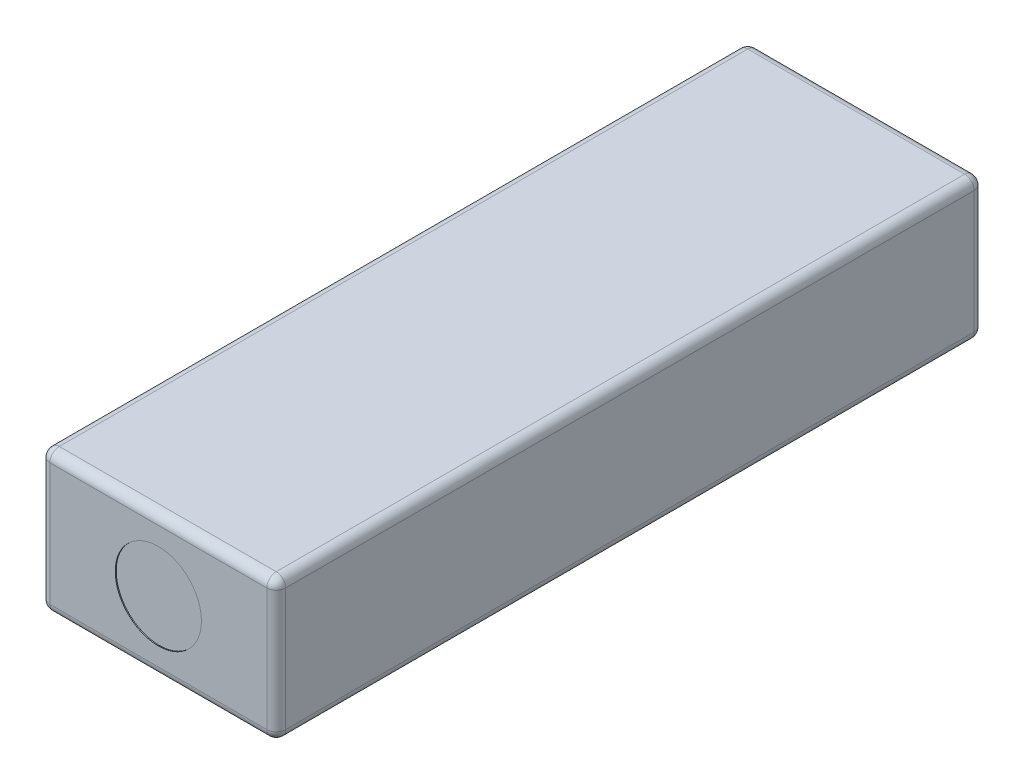
ISO-10303-21;
HEADER;
FILE_DESCRIPTION(('STEP AP214'),'2;1');
FILE_NAME('part.step','',(''),(''),'','','');
FILE_SCHEMA(('AUTOMOTIVE_DESIGN { 1 0 10303 214 1 1 1 1 }'));
ENDSEC;
DATA;
#1=APPLICATION_CONTEXT('core data for automotive mechanical design processes');
#2=APPLICATION_PROTOCOL_DEFINITION('international standard','automotive_design',2000,#1);
#3=PRODUCT_CONTEXT('',#1,'mechanical');
#4=PRODUCT('Part','Part','',(#3));
#5=PRODUCT_RELATED_PRODUCT_CATEGORY('part','',(#4));
#6=PRODUCT_DEFINITION_FORMATION('','',#4);
#7=PRODUCT_DEFINITION_CONTEXT('part definition',#1,'design');
#8=PRODUCT_DEFINITION('design','',#6,#7);
#9=PRODUCT_DEFINITION_SHAPE('','',#8);
#10=(LENGTH_UNIT() NAMED_UNIT(*) SI_UNIT(.MILLI.,.METRE.));
#11=(NAMED_UNIT(*) PLANE_ANGLE_UNIT() SI_UNIT($,.RADIAN.));
#12=(NAMED_UNIT(*) SI_UNIT($,.STERADIAN.) SOLID_ANGLE_UNIT());
#13=UNCERTAINTY_MEASURE_WITH_UNIT(LENGTH_MEASURE(1.E-05),#10,'distance_accuracy_value','');
#14=(GEOMETRIC_REPRESENTATION_CONTEXT(3) GLOBAL_UNCERTAINTY_ASSIGNED_CONTEXT((#13)) GLOBAL_UNIT_ASSIGNED_CONTEXT((#10,
#11,#12)) REPRESENTATION_CONTEXT('',''));
#15=CARTESIAN_POINT('',(0.,0.,0.));
#16=DIRECTION('',(0.,0.,1.));
#17=DIRECTION('',(1.,0.,0.));
#18=AXIS2_PLACEMENT_3D('',#15,#16,#17);
#19=CARTESIAN_POINT('',(25.,30.,-75.));
#20=DIRECTION('',(-1.,0.,0.));
#21=DIRECTION('',(0.,0.,1.));
#22=AXIS2_PLACEMENT_3D('',#19,#20,#21);
#23=PLANE('',#22);
#24=DIRECTION('',(0.,-1.,0.));
#25=VECTOR('',#24,1.);
#26=CARTESIAN_POINT('',(25.,30.,73.));
#27=LINE('',#26,#25);
#28=CARTESIAN_POINT('',(25.,28.,73.));
#29=VERTEX_POINT('',#28);
#30=CARTESIAN_POINT('',(25.,2.,73.));
#31=VERTEX_POINT('',#30);
#32=EDGE_CURVE('E141',#29,#31,#27,.T.);
#33=ORIENTED_EDGE('',*,*,#32,.T.);
#34=DIRECTION('',(0.,0.,-1.));
#35=VECTOR('',#34,1.);
#36=CARTESIAN_POINT('',(25.,2.,-75.));
#37=LINE('',#36,#35);
#38=CARTESIAN_POINT('',(25.,2.,-73.));
#39=VERTEX_POINT('',#38);
#40=EDGE_CURVE('E136',#31,#39,#37,.T.);
#41=ORIENTED_EDGE('',*,*,#40,.T.);
#42=DIRECTION('',(0.,-1.,0.));
#43=VECTOR('',#42,1.);
#44=CARTESIAN_POINT('',(25.,30.,-73.));
#45=LINE('',#44,#43);
#46=CARTESIAN_POINT('',(25.,28.,-73.));
#47=VERTEX_POINT('',#46);
#48=EDGE_CURVE('E131',#39,#47,#45,.F.);
#49=ORIENTED_EDGE('',*,*,#48,.T.);
#50=DIRECTION('',(0.,0.,-1.));
#51=VECTOR('',#50,1.);
#52=CARTESIAN_POINT('',(25.,28.,75.));
#53=LINE('',#52,#51);
#54=EDGE_CURVE('E133',#47,#29,#53,.F.);
#55=ORIENTED_EDGE('',*,*,#54,.T.);
#56=EDGE_LOOP('',(#33,#41,#49,#55));
#57=FACE_BOUND('',#56,.T.);
#58=ADVANCED_FACE('F42',(#57),#23,.F.);
#59=CARTESIAN_POINT('',(-25.,30.,-75.));
#60=DIRECTION('',(0.,0.,1.));
#61=DIRECTION('',(1.,0.,0.));
#62=AXIS2_PLACEMENT_3D('',#59,#60,#61);
#63=PLANE('',#62);
#64=DIRECTION('',(-1.,0.,0.));
#65=VECTOR('',#64,1.);
#66=CARTESIAN_POINT('',(25.,28.,-75.));
#67=LINE('',#66,#65);
#68=CARTESIAN_POINT('',(-23.,28.,-75.));
#69=VERTEX_POINT('',#68);
#70=CARTESIAN_POINT('',(23.,28.,-75.));
#71=VERTEX_POINT('',#70);
#72=EDGE_CURVE('E266',#69,#71,#67,.F.);
#73=ORIENTED_EDGE('',*,*,#72,.T.);
#74=DIRECTION('',(0.,-1.,0.));
#75=VECTOR('',#74,1.);
#76=CARTESIAN_POINT('',(23.,30.,-75.));
#77=LINE('',#76,#75);
#78=CARTESIAN_POINT('',(23.,2.,-75.));
#79=VERTEX_POINT('',#78);
#80=EDGE_CURVE('E165',#71,#79,#77,.T.);
#81=ORIENTED_EDGE('',*,*,#80,.T.);
#82=DIRECTION('',(-1.,0.,0.));
#83=VECTOR('',#82,1.);
#84=CARTESIAN_POINT('',(-25.,2.,-75.));
#85=LINE('',#84,#83);
#86=CARTESIAN_POINT('',(-23.,2.,-75.));
#87=VERTEX_POINT('',#86);
#88=EDGE_CURVE('E269',#79,#87,#85,.T.);
#89=ORIENTED_EDGE('',*,*,#88,.T.);
#90=DIRECTION('',(0.,-1.,0.));
#91=VECTOR('',#90,1.);
#92=CARTESIAN_POINT('',(-23.,30.,-75.));
#93=LINE('',#92,#91);
#94=EDGE_CURVE('E263',#87,#69,#93,.F.);
#95=ORIENTED_EDGE('',*,*,#94,.T.);
#96=EDGE_LOOP('',(#73,#81,#89,#95));
#97=FACE_BOUND('',#96,.T.);
#98=ADVANCED_FACE('F341',(#97),#63,.F.);
#99=CARTESIAN_POINT('',(-25.,30.,-75.));
#100=DIRECTION('',(1.,0.,0.));
#101=DIRECTION('',(0.,0.,-1.));
#102=AXIS2_PLACEMENT_3D('',#99,#100,#101);
#103=PLANE('',#102);
#104=DIRECTION('',(0.,0.,1.));
#105=VECTOR('',#104,1.);
#106=CARTESIAN_POINT('',(-25.,28.,-75.));
#107=LINE('',#106,#105);
#108=CARTESIAN_POINT('',(-25.,28.,73.));
#109=VERTEX_POINT('',#108);
#110=CARTESIAN_POINT('',(-25.,28.,-73.));
#111=VERTEX_POINT('',#110);
#112=EDGE_CURVE('E52',#109,#111,#107,.F.);
#113=ORIENTED_EDGE('',*,*,#112,.T.);
#114=DIRECTION('',(0.,-1.,0.));
#115=VECTOR('',#114,1.);
#116=CARTESIAN_POINT('',(-25.,30.,-73.));
#117=LINE('',#116,#115);
#118=CARTESIAN_POINT('',(-25.,2.,-73.));
#119=VERTEX_POINT('',#118);
#120=EDGE_CURVE('E11',#111,#119,#117,.T.);
#121=ORIENTED_EDGE('',*,*,#120,.T.);
#122=DIRECTION('',(0.,0.,1.));
#123=VECTOR('',#122,1.);
#124=CARTESIAN_POINT('',(-25.,2.,-75.));
#125=LINE('',#124,#123);
#126=CARTESIAN_POINT('',(-25.,2.,73.));
#127=VERTEX_POINT('',#126);
#128=EDGE_CURVE('E287',#119,#127,#125,.T.);
#129=ORIENTED_EDGE('',*,*,#128,.T.);
#130=DIRECTION('',(0.,-1.,0.));
#131=VECTOR('',#130,1.);
#132=CARTESIAN_POINT('',(-25.,30.,73.));
#133=LINE('',#132,#131);
#134=EDGE_CURVE('E63',#127,#109,#133,.F.);
#135=ORIENTED_EDGE('',*,*,#134,.T.);
#136=EDGE_LOOP('',(#113,#121,#129,#135));
#137=FACE_BOUND('',#136,.T.);
#138=ADVANCED_FACE('F354',(#137),#103,.F.);
#139=CARTESIAN_POINT('',(-25.,30.,75.));
#140=DIRECTION('',(0.,0.,-1.));
#141=DIRECTION('',(-1.,0.,0.));
#142=AXIS2_PLACEMENT_3D('',#139,#140,#141);
#143=PLANE('',#142);
#144=CARTESIAN_POINT('',(0.,15.,75.));
#145=DIRECTION('',(0.,0.,1.));
#146=DIRECTION('',(1.,0.,0.));
#147=AXIS2_PLACEMENT_3D('',#144,#145,#146);
#148=CIRCLE('',#147,9.14009032187981);
#149=CARTESIAN_POINT('',(9.14009032187981,15.,75.));
#150=VERTEX_POINT('',#149);
#151=EDGE_CURVE('E659',#150,#150,#148,.T.);
#152=ORIENTED_EDGE('',*,*,#151,.F.);
#153=EDGE_LOOP('',(#152));
#154=FACE_BOUND('',#153,.T.);
#155=DIRECTION('',(1.,0.,0.));
#156=VECTOR('',#155,1.);
#157=CARTESIAN_POINT('',(-25.,2.,75.));
#158=LINE('',#157,#156);
#159=CARTESIAN_POINT('',(-23.,2.,75.));
#160=VERTEX_POINT('',#159);
#161=CARTESIAN_POINT('',(23.,2.,75.));
#162=VERTEX_POINT('',#161);
#163=EDGE_CURVE('E250',#160,#162,#158,.T.);
#164=ORIENTED_EDGE('',*,*,#163,.T.);
#165=DIRECTION('',(0.,-1.,0.));
#166=VECTOR('',#165,1.);
#167=CARTESIAN_POINT('',(23.,30.,75.));
#168=LINE('',#167,#166);
#169=CARTESIAN_POINT('',(23.,28.,75.));
#170=VERTEX_POINT('',#169);
#171=EDGE_CURVE('E259',#162,#170,#168,.F.);
#172=ORIENTED_EDGE('',*,*,#171,.T.);
#173=DIRECTION('',(1.,0.,0.));
#174=VECTOR('',#173,1.);
#175=CARTESIAN_POINT('',(-25.,28.,75.));
#176=LINE('',#175,#174);
#177=CARTESIAN_POINT('',(-23.,28.,75.));
#178=VERTEX_POINT('',#177);
#179=EDGE_CURVE('E245',#170,#178,#176,.F.);
#180=ORIENTED_EDGE('',*,*,#179,.T.);
#181=DIRECTION('',(0.,-1.,0.));
#182=VECTOR('',#181,1.);
#183=CARTESIAN_POINT('',(-23.,30.,75.));
#184=LINE('',#183,#182);
#185=EDGE_CURVE('E241',#178,#160,#184,.T.);
#186=ORIENTED_EDGE('',*,*,#185,.T.);
#187=EDGE_LOOP('',(#164,#172,#180,#186));
#188=FACE_BOUND('',#187,.T.);
#189=ADVANCED_FACE('F362',(#154,#188),#143,.F.);
#190=CARTESIAN_POINT('',(0.,30.,0.));
#191=DIRECTION('',(0.,1.,0.));
#192=DIRECTION('',(0.,0.,1.));
#193=AXIS2_PLACEMENT_3D('',#190,#191,#192);
#194=PLANE('',#193);
#195=DIRECTION('',(1.,0.,0.));
#196=VECTOR('',#195,1.);
#197=CARTESIAN_POINT('',(25.,30.,73.));
#198=LINE('',#197,#196);
#199=CARTESIAN_POINT('',(-23.,30.,73.));
#200=VERTEX_POINT('',#199);
#201=CARTESIAN_POINT('',(23.,30.,73.));
#202=VERTEX_POINT('',#201);
#203=EDGE_CURVE('E280',#200,#202,#198,.T.);
#204=ORIENTED_EDGE('',*,*,#203,.T.);
#205=DIRECTION('',(0.,0.,-1.));
#206=VECTOR('',#205,1.);
#207=CARTESIAN_POINT('',(23.,30.,-75.));
#208=LINE('',#207,#206);
#209=CARTESIAN_POINT('',(23.,30.,-73.));
#210=VERTEX_POINT('',#209);
#211=EDGE_CURVE('E284',#202,#210,#208,.T.);
#212=ORIENTED_EDGE('',*,*,#211,.T.);
#213=DIRECTION('',(-1.,0.,0.));
#214=VECTOR('',#213,1.);
#215=CARTESIAN_POINT('',(-25.,30.,-73.));
#216=LINE('',#215,#214);
#217=CARTESIAN_POINT('',(-23.,30.,-73.));
#218=VERTEX_POINT('',#217);
#219=EDGE_CURVE('E277',#210,#218,#216,.T.);
#220=ORIENTED_EDGE('',*,*,#219,.T.);
#221=DIRECTION('',(0.,0.,1.));
#222=VECTOR('',#221,1.);
#223=CARTESIAN_POINT('',(-23.,30.,75.));
#224=LINE('',#223,#222);
#225=EDGE_CURVE('E274',#218,#200,#224,.T.);
#226=ORIENTED_EDGE('',*,*,#225,.T.);
#227=EDGE_LOOP('',(#204,#212,#220,#226));
#228=FACE_BOUND('',#227,.T.);
#229=ADVANCED_FACE('F347',(#228),#194,.T.);
#230=CARTESIAN_POINT('',(0.,0.,0.));
#231=DIRECTION('',(0.,1.,0.));
#232=DIRECTION('',(0.,0.,1.));
#233=AXIS2_PLACEMENT_3D('',#230,#231,#232);
#234=PLANE('',#233);
#235=DIRECTION('',(-1.,0.,0.));
#236=VECTOR('',#235,1.);
#237=CARTESIAN_POINT('',(0.,0.,-73.));
#238=LINE('',#237,#236);
#239=CARTESIAN_POINT('',(-23.,0.,-73.));
#240=VERTEX_POINT('',#239);
#241=CARTESIAN_POINT('',(23.,0.,-73.));
#242=VERTEX_POINT('',#241);
#243=EDGE_CURVE('E325',#240,#242,#238,.F.);
#244=ORIENTED_EDGE('',*,*,#243,.T.);
#245=DIRECTION('',(0.,0.,-1.));
#246=VECTOR('',#245,1.);
#247=CARTESIAN_POINT('',(23.,0.,0.));
#248=LINE('',#247,#246);
#249=CARTESIAN_POINT('',(23.,0.,73.));
#250=VERTEX_POINT('',#249);
#251=EDGE_CURVE('E246',#242,#250,#248,.F.);
#252=ORIENTED_EDGE('',*,*,#251,.T.);
#253=DIRECTION('',(1.,0.,0.));
#254=VECTOR('',#253,1.);
#255=CARTESIAN_POINT('',(0.,0.,73.));
#256=LINE('',#255,#254);
#257=CARTESIAN_POINT('',(-23.,0.,73.));
#258=VERTEX_POINT('',#257);
#259=EDGE_CURVE('E253',#250,#258,#256,.F.);
#260=ORIENTED_EDGE('',*,*,#259,.T.);
#261=DIRECTION('',(0.,0.,1.));
#262=VECTOR('',#261,1.);
#263=CARTESIAN_POINT('',(-23.,0.,0.));
#264=LINE('',#263,#262);
#265=EDGE_CURVE('E358',#258,#240,#264,.F.);
#266=ORIENTED_EDGE('',*,*,#265,.T.);
#267=EDGE_LOOP('',(#244,#252,#260,#266));
#268=FACE_BOUND('',#267,.T.);
#269=ADVANCED_FACE('F327',(#268),#234,.F.);
#270=CARTESIAN_POINT('',(-23.,28.,0.));
#271=DIRECTION('',(0.,0.,-1.));
#272=DIRECTION('',(-1.,0.,0.));
#273=AXIS2_PLACEMENT_3D('',#270,#271,#272);
#274=CYLINDRICAL_SURFACE('',#273,2.);
#275=CARTESIAN_POINT('',(-23.,28.,73.));
#276=DIRECTION('',(0.,0.,1.));
#277=DIRECTION('',(1.,0.,0.));
#278=AXIS2_PLACEMENT_3D('',#275,#276,#277);
#279=CIRCLE('',#278,2.);
#280=EDGE_CURVE('E46',#200,#109,#279,.T.);
#281=ORIENTED_EDGE('',*,*,#280,.F.);
#282=ORIENTED_EDGE('',*,*,#225,.F.);
#283=CARTESIAN_POINT('',(-23.,28.,-73.));
#284=DIRECTION('',(0.,0.,-1.));
#285=DIRECTION('',(-1.,0.,0.));
#286=AXIS2_PLACEMENT_3D('',#283,#284,#285);
#287=CIRCLE('',#286,2.);
#288=EDGE_CURVE('E220',#111,#218,#287,.T.);
#289=ORIENTED_EDGE('',*,*,#288,.F.);
#290=ORIENTED_EDGE('',*,*,#112,.F.);
#291=EDGE_LOOP('',(#281,#282,#289,#290));
#292=FACE_BOUND('',#291,.T.);
#293=ADVANCED_FACE('F44',(#292),#274,.T.);
#294=CARTESIAN_POINT('',(-23.,28.,73.));
#295=DIRECTION('',(-1.,0.,0.));
#296=DIRECTION('',(0.,0.,1.));
#297=AXIS2_PLACEMENT_3D('',#294,#295,#296);
#298=SPHERICAL_SURFACE('',#297,2.);
#299=CARTESIAN_POINT('',(-23.,28.,73.));
#300=DIRECTION('',(-1.,0.,0.));
#301=DIRECTION('',(0.,0.,1.));
#302=AXIS2_PLACEMENT_3D('',#299,#300,#301);
#303=CIRCLE('',#302,2.);
#304=EDGE_CURVE('E213',#200,#178,#303,.F.);
#305=ORIENTED_EDGE('',*,*,#304,.F.);
#306=ORIENTED_EDGE('',*,*,#280,.T.);
#307=CARTESIAN_POINT('',(-23.,28.,73.));
#308=DIRECTION('',(0.,1.,0.));
#309=DIRECTION('',(0.,0.,1.));
#310=AXIS2_PLACEMENT_3D('',#307,#308,#309);
#311=CIRCLE('',#310,2.);
#312=EDGE_CURVE('E217',#178,#109,#311,.F.);
#313=ORIENTED_EDGE('',*,*,#312,.F.);
#314=EDGE_LOOP('',(#305,#306,#313));
#315=FACE_BOUND('',#314,.T.);
#316=ADVANCED_FACE('F232',(#315),#298,.T.);
#317=CARTESIAN_POINT('',(-23.,28.,-73.));
#318=DIRECTION('',(0.,1.,0.));
#319=DIRECTION('',(0.,0.,1.));
#320=AXIS2_PLACEMENT_3D('',#317,#318,#319);
#321=SPHERICAL_SURFACE('',#320,2.);
#322=CARTESIAN_POINT('',(-23.,28.,-73.));
#323=DIRECTION('',(0.,1.,0.));
#324=DIRECTION('',(0.,0.,1.));
#325=AXIS2_PLACEMENT_3D('',#322,#323,#324);
#326=CIRCLE('',#325,2.);
#327=EDGE_CURVE('E205',#111,#69,#326,.F.);
#328=ORIENTED_EDGE('',*,*,#327,.F.);
#329=ORIENTED_EDGE('',*,*,#288,.T.);
#330=CARTESIAN_POINT('',(-23.,28.,-73.));
#331=DIRECTION('',(-1.,0.,0.));
#332=DIRECTION('',(0.,0.,1.));
#333=AXIS2_PLACEMENT_3D('',#330,#331,#332);
#334=CIRCLE('',#333,2.);
#335=EDGE_CURVE('E209',#69,#218,#334,.F.);
#336=ORIENTED_EDGE('',*,*,#335,.F.);
#337=EDGE_LOOP('',(#328,#329,#336));
#338=FACE_BOUND('',#337,.T.);
#339=ADVANCED_FACE('F349',(#338),#321,.T.);
#340=CARTESIAN_POINT('',(-23.,30.,73.));
#341=DIRECTION('',(0.,-1.,0.));
#342=DIRECTION('',(0.,0.,-1.));
#343=AXIS2_PLACEMENT_3D('',#340,#341,#342);
#344=CYLINDRICAL_SURFACE('',#343,2.);
#345=ORIENTED_EDGE('',*,*,#312,.T.);
#346=ORIENTED_EDGE('',*,*,#134,.F.);
#347=CARTESIAN_POINT('',(-23.,2.,73.));
#348=DIRECTION('',(0.,-1.,0.));
#349=DIRECTION('',(0.,0.,-1.));
#350=AXIS2_PLACEMENT_3D('',#347,#348,#349);
#351=CIRCLE('',#350,2.);
#352=EDGE_CURVE('E197',#160,#127,#351,.T.);
#353=ORIENTED_EDGE('',*,*,#352,.F.);
#354=ORIENTED_EDGE('',*,*,#185,.F.);
#355=EDGE_LOOP('',(#345,#346,#353,#354));
#356=FACE_BOUND('',#355,.T.);
#357=ADVANCED_FACE('F238',(#356),#344,.T.);
#358=CARTESIAN_POINT('',(0.,28.,73.));
#359=DIRECTION('',(-1.,0.,0.));
#360=DIRECTION('',(0.,0.,1.));
#361=AXIS2_PLACEMENT_3D('',#358,#359,#360);
#362=CYLINDRICAL_SURFACE('',#361,2.);
#363=ORIENTED_EDGE('',*,*,#304,.T.);
#364=ORIENTED_EDGE('',*,*,#179,.F.);
#365=CARTESIAN_POINT('',(23.,28.,73.));
#366=DIRECTION('',(1.,0.,0.));
#367=DIRECTION('',(0.,0.,-1.));
#368=AXIS2_PLACEMENT_3D('',#365,#366,#367);
#369=CIRCLE('',#368,2.);
#370=EDGE_CURVE('E193',#202,#170,#369,.T.);
#371=ORIENTED_EDGE('',*,*,#370,.F.);
#372=ORIENTED_EDGE('',*,*,#203,.F.);
#373=EDGE_LOOP('',(#363,#364,#371,#372));
#374=FACE_BOUND('',#373,.T.);
#375=ADVANCED_FACE('F371',(#374),#362,.T.);
#376=CARTESIAN_POINT('',(23.,28.,0.));
#377=DIRECTION('',(0.,0.,1.));
#378=DIRECTION('',(1.,0.,0.));
#379=AXIS2_PLACEMENT_3D('',#376,#377,#378);
#380=CYLINDRICAL_SURFACE('',#379,2.);
#381=CARTESIAN_POINT('',(23.,28.,-73.));
#382=DIRECTION('',(0.,0.,-1.));
#383=DIRECTION('',(-1.,0.,0.));
#384=AXIS2_PLACEMENT_3D('',#381,#382,#383);
#385=CIRCLE('',#384,2.);
#386=EDGE_CURVE('E148',#210,#47,#385,.T.);
#387=ORIENTED_EDGE('',*,*,#386,.F.);
#388=ORIENTED_EDGE('',*,*,#211,.F.);
#389=CARTESIAN_POINT('',(23.,28.,73.));
#390=DIRECTION('',(0.,0.,1.));
#391=DIRECTION('',(1.,0.,0.));
#392=AXIS2_PLACEMENT_3D('',#389,#390,#391);
#393=CIRCLE('',#392,2.);
#394=EDGE_CURVE('E150',#29,#202,#393,.T.);
#395=ORIENTED_EDGE('',*,*,#394,.F.);
#396=ORIENTED_EDGE('',*,*,#54,.F.);
#397=EDGE_LOOP('',(#387,#388,#395,#396));
#398=FACE_BOUND('',#397,.T.);
#399=ADVANCED_FACE('F146',(#398),#380,.T.);
#400=CARTESIAN_POINT('',(0.,28.,-73.));
#401=DIRECTION('',(1.,0.,0.));
#402=DIRECTION('',(0.,0.,-1.));
#403=AXIS2_PLACEMENT_3D('',#400,#401,#402);
#404=CYLINDRICAL_SURFACE('',#403,2.);
#405=ORIENTED_EDGE('',*,*,#335,.T.);
#406=ORIENTED_EDGE('',*,*,#219,.F.);
#407=CARTESIAN_POINT('',(23.,28.,-73.));
#408=DIRECTION('',(1.,0.,0.));
#409=DIRECTION('',(0.,0.,-1.));
#410=AXIS2_PLACEMENT_3D('',#407,#408,#409);
#411=CIRCLE('',#410,2.);
#412=EDGE_CURVE('E160',#71,#210,#411,.T.);
#413=ORIENTED_EDGE('',*,*,#412,.F.);
#414=ORIENTED_EDGE('',*,*,#72,.F.);
#415=EDGE_LOOP('',(#405,#406,#413,#414));
#416=FACE_BOUND('',#415,.T.);
#417=ADVANCED_FACE('F345',(#416),#404,.T.);
#418=CARTESIAN_POINT('',(-23.,30.,-73.));
#419=DIRECTION('',(0.,-1.,0.));
#420=DIRECTION('',(0.,0.,-1.));
#421=AXIS2_PLACEMENT_3D('',#418,#419,#420);
#422=CYLINDRICAL_SURFACE('',#421,2.);
#423=ORIENTED_EDGE('',*,*,#327,.T.);
#424=ORIENTED_EDGE('',*,*,#94,.F.);
#425=CARTESIAN_POINT('',(-23.,2.,-73.));
#426=DIRECTION('',(0.,-1.,0.));
#427=DIRECTION('',(0.,0.,-1.));
#428=AXIS2_PLACEMENT_3D('',#425,#426,#427);
#429=CIRCLE('',#428,2.);
#430=EDGE_CURVE('E185',#119,#87,#429,.T.);
#431=ORIENTED_EDGE('',*,*,#430,.F.);
#432=ORIENTED_EDGE('',*,*,#120,.F.);
#433=EDGE_LOOP('',(#423,#424,#431,#432));
#434=FACE_BOUND('',#433,.T.);
#435=ADVANCED_FACE('F352',(#434),#422,.T.);
#436=CARTESIAN_POINT('',(-23.,2.,-75.));
#437=DIRECTION('',(0.,0.,1.));
#438=DIRECTION('',(1.,0.,0.));
#439=AXIS2_PLACEMENT_3D('',#436,#437,#438);
#440=CYLINDRICAL_SURFACE('',#439,2.);
#441=CARTESIAN_POINT('',(-23.,2.,73.));
#442=DIRECTION('',(0.,0.,1.));
#443=DIRECTION('',(1.,0.,0.));
#444=AXIS2_PLACEMENT_3D('',#441,#442,#443);
#445=CIRCLE('',#444,2.);
#446=EDGE_CURVE('E201',#127,#258,#445,.T.);
#447=ORIENTED_EDGE('',*,*,#446,.F.);
#448=ORIENTED_EDGE('',*,*,#128,.F.);
#449=CARTESIAN_POINT('',(-23.,2.,-73.));
#450=DIRECTION('',(0.,0.,-1.));
#451=DIRECTION('',(-1.,0.,0.));
#452=AXIS2_PLACEMENT_3D('',#449,#450,#451);
#453=CIRCLE('',#452,2.);
#454=EDGE_CURVE('E182',#240,#119,#453,.T.);
#455=ORIENTED_EDGE('',*,*,#454,.F.);
#456=ORIENTED_EDGE('',*,*,#265,.F.);
#457=EDGE_LOOP('',(#447,#448,#455,#456));
#458=FACE_BOUND('',#457,.T.);
#459=ADVANCED_FACE('F357',(#458),#440,.T.);
#460=CARTESIAN_POINT('',(-23.,2.,73.));
#461=DIRECTION('',(-1.,0.,0.));
#462=DIRECTION('',(0.,-1.,0.));
#463=AXIS2_PLACEMENT_3D('',#460,#461,#462);
#464=SPHERICAL_SURFACE('',#463,2.);
#465=ORIENTED_EDGE('',*,*,#352,.T.);
#466=ORIENTED_EDGE('',*,*,#446,.T.);
#467=CARTESIAN_POINT('',(-23.,2.,73.));
#468=DIRECTION('',(-1.,0.,0.));
#469=DIRECTION('',(0.,0.,1.));
#470=AXIS2_PLACEMENT_3D('',#467,#468,#469);
#471=CIRCLE('',#470,2.);
#472=EDGE_CURVE('E172',#160,#258,#471,.F.);
#473=ORIENTED_EDGE('',*,*,#472,.F.);
#474=EDGE_LOOP('',(#465,#466,#473));
#475=FACE_BOUND('',#474,.T.);
#476=ADVANCED_FACE('F360',(#475),#464,.T.);
#477=CARTESIAN_POINT('',(23.,28.,73.));
#478=DIRECTION('',(0.,1.,0.));
#479=DIRECTION('',(0.,0.,1.));
#480=AXIS2_PLACEMENT_3D('',#477,#478,#479);
#481=SPHERICAL_SURFACE('',#480,2.);
#482=ORIENTED_EDGE('',*,*,#394,.T.);
#483=ORIENTED_EDGE('',*,*,#370,.T.);
#484=CARTESIAN_POINT('',(23.,28.,73.));
#485=DIRECTION('',(0.,1.,0.));
#486=DIRECTION('',(0.,0.,1.));
#487=AXIS2_PLACEMENT_3D('',#484,#485,#486);
#488=CIRCLE('',#487,2.);
#489=EDGE_CURVE('E167',#29,#170,#488,.F.);
#490=ORIENTED_EDGE('',*,*,#489,.F.);
#491=EDGE_LOOP('',(#482,#483,#490));
#492=FACE_BOUND('',#491,.T.);
#493=ADVANCED_FACE('F369',(#492),#481,.T.);
#494=CARTESIAN_POINT('',(23.,28.,-73.));
#495=DIRECTION('',(0.,1.,0.));
#496=DIRECTION('',(0.,0.,1.));
#497=AXIS2_PLACEMENT_3D('',#494,#495,#496);
#498=SPHERICAL_SURFACE('',#497,2.);
#499=ORIENTED_EDGE('',*,*,#412,.T.);
#500=ORIENTED_EDGE('',*,*,#386,.T.);
#501=CARTESIAN_POINT('',(23.,28.,-73.));
#502=DIRECTION('',(0.,1.,0.));
#503=DIRECTION('',(0.,0.,1.));
#504=AXIS2_PLACEMENT_3D('',#501,#502,#503);
#505=CIRCLE('',#504,2.);
#506=EDGE_CURVE('E157',#71,#47,#505,.F.);
#507=ORIENTED_EDGE('',*,*,#506,.F.);
#508=EDGE_LOOP('',(#499,#500,#507));
#509=FACE_BOUND('',#508,.T.);
#510=ADVANCED_FACE('F156',(#509),#498,.T.);
#511=CARTESIAN_POINT('',(-23.,2.,-73.));
#512=DIRECTION('',(-1.,0.,0.));
#513=DIRECTION('',(0.,-1.,0.));
#514=AXIS2_PLACEMENT_3D('',#511,#512,#513);
#515=SPHERICAL_SURFACE('',#514,2.);
#516=ORIENTED_EDGE('',*,*,#454,.T.);
#517=ORIENTED_EDGE('',*,*,#430,.T.);
#518=CARTESIAN_POINT('',(-23.,2.,-73.));
#519=DIRECTION('',(-1.,0.,0.));
#520=DIRECTION('',(0.,0.,1.));
#521=AXIS2_PLACEMENT_3D('',#518,#519,#520);
#522=CIRCLE('',#521,2.);
#523=EDGE_CURVE('E168',#240,#87,#522,.F.);
#524=ORIENTED_EDGE('',*,*,#523,.F.);
#525=EDGE_LOOP('',(#516,#517,#524));
#526=FACE_BOUND('',#525,.T.);
#527=ADVANCED_FACE('F403',(#526),#515,.T.);
#528=CARTESIAN_POINT('',(-25.,2.,73.));
#529=DIRECTION('',(1.,0.,0.));
#530=DIRECTION('',(0.,0.,-1.));
#531=AXIS2_PLACEMENT_3D('',#528,#529,#530);
#532=CYLINDRICAL_SURFACE('',#531,2.);
#533=ORIENTED_EDGE('',*,*,#472,.T.);
#534=ORIENTED_EDGE('',*,*,#259,.F.);
#535=CARTESIAN_POINT('',(23.,2.,73.));
#536=DIRECTION('',(1.,0.,0.));
#537=DIRECTION('',(0.,0.,-1.));
#538=AXIS2_PLACEMENT_3D('',#535,#536,#537);
#539=CIRCLE('',#538,2.);
#540=EDGE_CURVE('E175',#162,#250,#539,.T.);
#541=ORIENTED_EDGE('',*,*,#540,.F.);
#542=ORIENTED_EDGE('',*,*,#163,.F.);
#543=EDGE_LOOP('',(#533,#534,#541,#542));
#544=FACE_BOUND('',#543,.T.);
#545=ADVANCED_FACE('F321',(#544),#532,.T.);
#546=CARTESIAN_POINT('',(23.,30.,73.));
#547=DIRECTION('',(0.,-1.,0.));
#548=DIRECTION('',(0.,0.,-1.));
#549=AXIS2_PLACEMENT_3D('',#546,#547,#548);
#550=CYLINDRICAL_SURFACE('',#549,2.);
#551=ORIENTED_EDGE('',*,*,#489,.T.);
#552=ORIENTED_EDGE('',*,*,#171,.F.);
#553=CARTESIAN_POINT('',(23.,2.,73.));
#554=DIRECTION('',(0.,-1.,0.));
#555=DIRECTION('',(0.,0.,-1.));
#556=AXIS2_PLACEMENT_3D('',#553,#554,#555);
#557=CIRCLE('',#556,2.);
#558=EDGE_CURVE('E308',#31,#162,#557,.T.);
#559=ORIENTED_EDGE('',*,*,#558,.F.);
#560=ORIENTED_EDGE('',*,*,#32,.F.);
#561=EDGE_LOOP('',(#551,#552,#559,#560));
#562=FACE_BOUND('',#561,.T.);
#563=ADVANCED_FACE('F364',(#562),#550,.T.);
#564=CARTESIAN_POINT('',(23.,30.,-73.));
#565=DIRECTION('',(0.,-1.,0.));
#566=DIRECTION('',(0.,0.,-1.));
#567=AXIS2_PLACEMENT_3D('',#564,#565,#566);
#568=CYLINDRICAL_SURFACE('',#567,2.);
#569=ORIENTED_EDGE('',*,*,#506,.T.);
#570=ORIENTED_EDGE('',*,*,#48,.F.);
#571=CARTESIAN_POINT('',(23.,2.,-73.));
#572=DIRECTION('',(0.,-1.,0.));
#573=DIRECTION('',(0.,0.,-1.));
#574=AXIS2_PLACEMENT_3D('',#571,#572,#573);
#575=CIRCLE('',#574,2.);
#576=EDGE_CURVE('E304',#79,#39,#575,.T.);
#577=ORIENTED_EDGE('',*,*,#576,.F.);
#578=ORIENTED_EDGE('',*,*,#80,.F.);
#579=EDGE_LOOP('',(#569,#570,#577,#578));
#580=FACE_BOUND('',#579,.T.);
#581=ADVANCED_FACE('F163',(#580),#568,.T.);
#582=CARTESIAN_POINT('',(-25.,2.,-73.));
#583=DIRECTION('',(-1.,0.,0.));
#584=DIRECTION('',(0.,0.,1.));
#585=AXIS2_PLACEMENT_3D('',#582,#583,#584);
#586=CYLINDRICAL_SURFACE('',#585,2.);
#587=ORIENTED_EDGE('',*,*,#523,.T.);
#588=ORIENTED_EDGE('',*,*,#88,.F.);
#589=CARTESIAN_POINT('',(23.,2.,-73.));
#590=DIRECTION('',(1.,0.,0.));
#591=DIRECTION('',(0.,0.,-1.));
#592=AXIS2_PLACEMENT_3D('',#589,#590,#591);
#593=CIRCLE('',#592,2.);
#594=EDGE_CURVE('E301',#242,#79,#593,.T.);
#595=ORIENTED_EDGE('',*,*,#594,.F.);
#596=ORIENTED_EDGE('',*,*,#243,.F.);
#597=EDGE_LOOP('',(#587,#588,#595,#596));
#598=FACE_BOUND('',#597,.T.);
#599=ADVANCED_FACE('F337',(#598),#586,.T.);
#600=CARTESIAN_POINT('',(23.,2.,73.));
#601=DIRECTION('',(0.,0.,1.));
#602=DIRECTION('',(0.,-1.,0.));
#603=AXIS2_PLACEMENT_3D('',#600,#601,#602);
#604=SPHERICAL_SURFACE('',#603,2.);
#605=ORIENTED_EDGE('',*,*,#558,.T.);
#606=ORIENTED_EDGE('',*,*,#540,.T.);
#607=CARTESIAN_POINT('',(23.,2.,73.));
#608=DIRECTION('',(0.,0.,1.));
#609=DIRECTION('',(1.,0.,0.));
#610=AXIS2_PLACEMENT_3D('',#607,#608,#609);
#611=CIRCLE('',#610,2.);
#612=EDGE_CURVE('E297',#31,#250,#611,.F.);
#613=ORIENTED_EDGE('',*,*,#612,.F.);
#614=EDGE_LOOP('',(#605,#606,#613));
#615=FACE_BOUND('',#614,.T.);
#616=ADVANCED_FACE('F317',(#615),#604,.T.);
#617=CARTESIAN_POINT('',(23.,2.,-73.));
#618=DIRECTION('',(0.,0.,-1.));
#619=DIRECTION('',(0.,1.,0.));
#620=AXIS2_PLACEMENT_3D('',#617,#618,#619);
#621=SPHERICAL_SURFACE('',#620,2.);
#622=ORIENTED_EDGE('',*,*,#594,.T.);
#623=ORIENTED_EDGE('',*,*,#576,.T.);
#624=CARTESIAN_POINT('',(23.,2.,-73.));
#625=DIRECTION('',(0.,0.,-1.));
#626=DIRECTION('',(-1.,0.,0.));
#627=AXIS2_PLACEMENT_3D('',#624,#625,#626);
#628=CIRCLE('',#627,2.);
#629=EDGE_CURVE('E294',#242,#39,#628,.F.);
#630=ORIENTED_EDGE('',*,*,#629,.F.);
#631=EDGE_LOOP('',(#622,#623,#630));
#632=FACE_BOUND('',#631,.T.);
#633=ADVANCED_FACE('F334',(#632),#621,.T.);
#634=CARTESIAN_POINT('',(23.,2.,-75.));
#635=DIRECTION('',(0.,0.,-1.));
#636=DIRECTION('',(-1.,0.,0.));
#637=AXIS2_PLACEMENT_3D('',#634,#635,#636);
#638=CYLINDRICAL_SURFACE('',#637,2.);
#639=ORIENTED_EDGE('',*,*,#612,.T.);
#640=ORIENTED_EDGE('',*,*,#251,.F.);
#641=ORIENTED_EDGE('',*,*,#629,.T.);
#642=ORIENTED_EDGE('',*,*,#40,.F.);
#643=EDGE_LOOP('',(#639,#640,#641,#642));
#644=FACE_BOUND('',#643,.T.);
#645=ADVANCED_FACE('F332',(#644),#638,.T.);
#646=CARTESIAN_POINT('',(0.,15.,74.8));
#647=DIRECTION('',(0.,0.,1.));
#648=DIRECTION('',(1.,0.,0.));
#649=AXIS2_PLACEMENT_3D('',#646,#647,#648);
#650=CYLINDRICAL_SURFACE('',#649,9.14009032187981);
#651=CARTESIAN_POINT('',(0.,15.,74.8));
#652=DIRECTION('',(0.,0.,1.));
#653=DIRECTION('',(1.,0.,0.));
#654=AXIS2_PLACEMENT_3D('',#651,#652,#653);
#655=CIRCLE('',#654,9.14009032187981);
#656=CARTESIAN_POINT('',(9.14009032187981,15.,74.8));
#657=VERTEX_POINT('',#656);
#658=EDGE_CURVE('E298',#657,#657,#655,.T.);
#659=ORIENTED_EDGE('',*,*,#658,.F.);
#660=EDGE_LOOP('',(#659));
#661=FACE_BOUND('',#660,.T.);
#662=ORIENTED_EDGE('',*,*,#151,.T.);
#663=EDGE_LOOP('',(#662));
#664=FACE_BOUND('',#663,.T.);
#665=ADVANCED_FACE('F390',(#661,#664),#650,.F.);
#666=CARTESIAN_POINT('',(0.,15.,74.8));
#667=DIRECTION('',(0.,0.,1.));
#668=DIRECTION('',(1.,0.,0.));
#669=AXIS2_PLACEMENT_3D('',#666,#667,#668);
#670=PLANE('',#669);
#671=ORIENTED_EDGE('',*,*,#658,.T.);
#672=EDGE_LOOP('',(#671));
#673=FACE_BOUND('',#672,.T.);
#674=ADVANCED_FACE('F481',(#673),#670,.T.);
#675=CLOSED_SHELL('',(#58,#98,#138,#189,#229,#269,#293,#316,#339,#357,#375,#399,#417,#435,#459,
#476,#493,#510,#527,#545,#563,#581,#599,#616,#633,#645,#665,#674));
#676=MANIFOLD_SOLID_BREP('B2',#675);
#677=ADVANCED_BREP_SHAPE_REPRESENTATION('',(#18,#676),#14);
#678=SHAPE_DEFINITION_REPRESENTATION(#9,#677);
ENDSEC;
END-ISO-10303-21;
